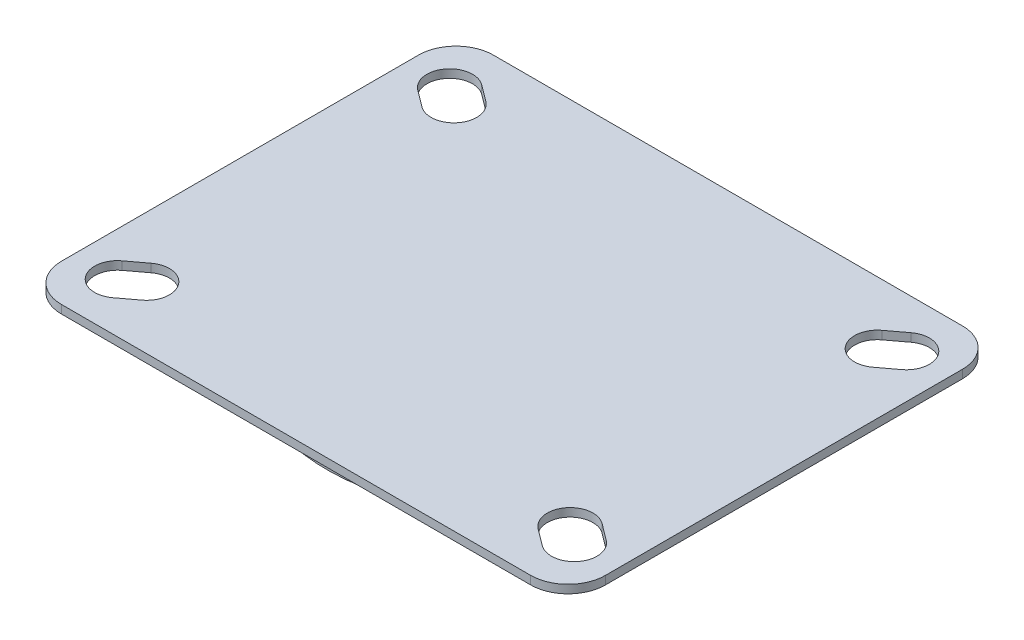
ISO-10303-21;
HEADER;
FILE_DESCRIPTION(('STEP AP214'),'2;1');
FILE_NAME('part.step','',(''),(''),'','','');
FILE_SCHEMA(('AUTOMOTIVE_DESIGN { 1 0 10303 214 1 1 1 1 }'));
ENDSEC;
DATA;
#1=APPLICATION_CONTEXT('core data for automotive mechanical design processes');
#2=APPLICATION_PROTOCOL_DEFINITION('international standard','automotive_design',2000,#1);
#3=PRODUCT_CONTEXT('',#1,'mechanical');
#4=PRODUCT('Part','Part','',(#3));
#5=PRODUCT_RELATED_PRODUCT_CATEGORY('part','',(#4));
#6=PRODUCT_DEFINITION_FORMATION('','',#4);
#7=PRODUCT_DEFINITION_CONTEXT('part definition',#1,'design');
#8=PRODUCT_DEFINITION('design','',#6,#7);
#9=PRODUCT_DEFINITION_SHAPE('','',#8);
#10=(LENGTH_UNIT() NAMED_UNIT(*) SI_UNIT(.MILLI.,.METRE.));
#11=(NAMED_UNIT(*) PLANE_ANGLE_UNIT() SI_UNIT($,.RADIAN.));
#12=(NAMED_UNIT(*) SI_UNIT($,.STERADIAN.) SOLID_ANGLE_UNIT());
#13=UNCERTAINTY_MEASURE_WITH_UNIT(LENGTH_MEASURE(1.E-05),#10,'distance_accuracy_value','');
#14=(GEOMETRIC_REPRESENTATION_CONTEXT(3) GLOBAL_UNCERTAINTY_ASSIGNED_CONTEXT((#13)) GLOBAL_UNIT_ASSIGNED_CONTEXT((#10,
#11,#12)) REPRESENTATION_CONTEXT('',''));
#15=CARTESIAN_POINT('',(0.,0.,0.));
#16=DIRECTION('',(0.,0.,1.));
#17=DIRECTION('',(1.,0.,0.));
#18=AXIS2_PLACEMENT_3D('',#15,#16,#17);
#19=CARTESIAN_POINT('',(0.,-10.,0.));
#20=DIRECTION('',(0.,1.,0.));
#21=DIRECTION('',(0.,0.,1.));
#22=AXIS2_PLACEMENT_3D('',#19,#20,#21);
#23=CYLINDRICAL_SURFACE('',#22,44.5);
#24=CARTESIAN_POINT('',(0.,-10.,0.));
#25=DIRECTION('',(0.,1.,0.));
#26=DIRECTION('',(1.,0.,0.));
#27=AXIS2_PLACEMENT_3D('',#24,#25,#26);
#28=CIRCLE('',#27,44.5);
#29=CARTESIAN_POINT('',(44.5,-10.,0.));
#30=VERTEX_POINT('',#29);
#31=EDGE_CURVE('E12',#30,#30,#28,.T.);
#32=ORIENTED_EDGE('',*,*,#31,.T.);
#33=EDGE_LOOP('',(#32));
#34=FACE_BOUND('',#33,.T.);
#35=CARTESIAN_POINT('',(0.,-2.,0.));
#36=DIRECTION('',(0.,1.,0.));
#37=DIRECTION('',(1.,0.,0.));
#38=AXIS2_PLACEMENT_3D('',#35,#36,#37);
#39=CIRCLE('',#38,44.5);
#40=CARTESIAN_POINT('',(44.5,-2.,0.));
#41=VERTEX_POINT('',#40);
#42=EDGE_CURVE('E57',#41,#41,#39,.T.);
#43=ORIENTED_EDGE('',*,*,#42,.F.);
#44=EDGE_LOOP('',(#43));
#45=FACE_BOUND('',#44,.T.);
#46=ADVANCED_FACE('F54',(#34,#45),#23,.T.);
#47=CARTESIAN_POINT('',(0.,-10.,0.));
#48=DIRECTION('',(0.,1.,0.));
#49=DIRECTION('',(0.,0.,1.));
#50=AXIS2_PLACEMENT_3D('',#47,#48,#49);
#51=PLANE('',#50);
#52=CARTESIAN_POINT('',(0.,-10.,0.));
#53=DIRECTION('',(0.,1.,0.));
#54=DIRECTION('',(0.,0.,1.));
#55=AXIS2_PLACEMENT_3D('',#52,#53,#54);
#56=CIRCLE('',#55,42.5);
#57=CARTESIAN_POINT('',(0.,-10.,42.5));
#58=VERTEX_POINT('',#57);
#59=EDGE_CURVE('E64',#58,#58,#56,.T.);
#60=ORIENTED_EDGE('',*,*,#59,.T.);
#61=EDGE_LOOP('',(#60));
#62=FACE_BOUND('',#61,.T.);
#63=ORIENTED_EDGE('',*,*,#31,.F.);
#64=EDGE_LOOP('',(#63));
#65=FACE_BOUND('',#64,.T.);
#66=ADVANCED_FACE('F72',(#62,#65),#51,.F.);
#67=CARTESIAN_POINT('',(0.,-2.,0.));
#68=DIRECTION('',(0.,1.,0.));
#69=DIRECTION('',(0.,0.,1.));
#70=AXIS2_PLACEMENT_3D('',#67,#68,#69);
#71=PLANE('',#70);
#72=CARTESIAN_POINT('',(0.,-2.,0.));
#73=DIRECTION('',(0.,1.,0.));
#74=DIRECTION('',(0.,0.,1.));
#75=AXIS2_PLACEMENT_3D('',#72,#73,#74);
#76=CIRCLE('',#75,42.5);
#77=CARTESIAN_POINT('',(0.,-2.,42.5));
#78=VERTEX_POINT('',#77);
#79=EDGE_CURVE('E66',#78,#78,#76,.T.);
#80=ORIENTED_EDGE('',*,*,#79,.F.);
#81=EDGE_LOOP('',(#80));
#82=FACE_BOUND('',#81,.T.);
#83=ORIENTED_EDGE('',*,*,#42,.T.);
#84=EDGE_LOOP('',(#83));
#85=FACE_BOUND('',#84,.T.);
#86=ADVANCED_FACE('F78',(#82,#85),#71,.T.);
#87=CARTESIAN_POINT('',(0.,-10.,0.));
#88=DIRECTION('',(0.,1.,0.));
#89=DIRECTION('',(0.,0.,1.));
#90=AXIS2_PLACEMENT_3D('',#87,#88,#89);
#91=CYLINDRICAL_SURFACE('',#90,42.5);
#92=ORIENTED_EDGE('',*,*,#59,.F.);
#93=EDGE_LOOP('',(#92));
#94=FACE_BOUND('',#93,.T.);
#95=ORIENTED_EDGE('',*,*,#79,.T.);
#96=EDGE_LOOP('',(#95));
#97=FACE_BOUND('',#96,.T.);
#98=ADVANCED_FACE('F75',(#94,#97),#91,.F.);
#99=CLOSED_SHELL('',(#46,#66,#86,#98));
#100=MANIFOLD_SOLID_BREP('B2',#99);
#101=CARTESIAN_POINT('',(-56.49561369755,-2.,42.99561369755));
#102=DIRECTION('',(0.,1.,0.));
#103=DIRECTION('',(0.,0.,1.));
#104=AXIS2_PLACEMENT_3D('',#101,#102,#103);
#105=CYLINDRICAL_SURFACE('',#104,9.00438630244995);
#106=CARTESIAN_POINT('',(-56.49561369755,0.,42.99561369755));
#107=DIRECTION('',(0.,1.,0.));
#108=DIRECTION('',(0.,0.,-1.));
#109=AXIS2_PLACEMENT_3D('',#106,#107,#108);
#110=CIRCLE('',#109,9.00438630244995);
#111=CARTESIAN_POINT('',(-65.5,0.,42.99561369755));
#112=VERTEX_POINT('',#111);
#113=CARTESIAN_POINT('',(-56.49561369755,0.,52.));
#114=VERTEX_POINT('',#113);
#115=EDGE_CURVE('E403',#112,#114,#110,.T.);
#116=ORIENTED_EDGE('',*,*,#115,.F.);
#117=DIRECTION('',(0.,1.,0.));
#118=VECTOR('',#117,1.);
#119=CARTESIAN_POINT('',(-65.5,-2.,42.99561369755));
#120=LINE('',#119,#118);
#121=CARTESIAN_POINT('',(-65.5,-2.,42.99561369755));
#122=VERTEX_POINT('',#121);
#123=EDGE_CURVE('E52',#122,#112,#120,.T.);
#124=ORIENTED_EDGE('',*,*,#123,.F.);
#125=CARTESIAN_POINT('',(-56.49561369755,-2.,42.99561369755));
#126=DIRECTION('',(0.,1.,0.));
#127=DIRECTION('',(0.,0.,-1.));
#128=AXIS2_PLACEMENT_3D('',#125,#126,#127);
#129=CIRCLE('',#128,9.00438630244995);
#130=CARTESIAN_POINT('',(-56.49561369755,-2.,52.));
#131=VERTEX_POINT('',#130);
#132=EDGE_CURVE('E410',#122,#131,#129,.T.);
#133=ORIENTED_EDGE('',*,*,#132,.T.);
#134=DIRECTION('',(0.,1.,0.));
#135=VECTOR('',#134,1.);
#136=CARTESIAN_POINT('',(-56.49561369755,-2.,52.));
#137=LINE('',#136,#135);
#138=EDGE_CURVE('E119',#131,#114,#137,.T.);
#139=ORIENTED_EDGE('',*,*,#138,.T.);
#140=EDGE_LOOP('',(#116,#124,#133,#139));
#141=FACE_BOUND('',#140,.T.);
#142=ADVANCED_FACE('F116',(#141),#105,.T.);
#143=CARTESIAN_POINT('',(-65.5,-2.,42.99561369755));
#144=DIRECTION('',(-1.,0.,0.));
#145=DIRECTION('',(0.,0.,1.));
#146=AXIS2_PLACEMENT_3D('',#143,#144,#145);
#147=PLANE('',#146);
#148=DIRECTION('',(0.,0.,1.));
#149=VECTOR('',#148,1.);
#150=CARTESIAN_POINT('',(-65.5,0.,42.99561369755));
#151=LINE('',#150,#149);
#152=CARTESIAN_POINT('',(-65.5,0.,-42.99561369755));
#153=VERTEX_POINT('',#152);
#154=EDGE_CURVE('E414',#153,#112,#151,.T.);
#155=ORIENTED_EDGE('',*,*,#154,.F.);
#156=DIRECTION('',(0.,1.,0.));
#157=VECTOR('',#156,1.);
#158=CARTESIAN_POINT('',(-65.5,-2.,-42.99561369755));
#159=LINE('',#158,#157);
#160=CARTESIAN_POINT('',(-65.5,-2.,-42.99561369755));
#161=VERTEX_POINT('',#160);
#162=EDGE_CURVE('E124',#161,#153,#159,.T.);
#163=ORIENTED_EDGE('',*,*,#162,.F.);
#164=DIRECTION('',(0.,0.,1.));
#165=VECTOR('',#164,1.);
#166=CARTESIAN_POINT('',(-65.5,-2.,42.99561369755));
#167=LINE('',#166,#165);
#168=EDGE_CURVE('E432',#161,#122,#167,.T.);
#169=ORIENTED_EDGE('',*,*,#168,.T.);
#170=ORIENTED_EDGE('',*,*,#123,.T.);
#171=EDGE_LOOP('',(#155,#163,#169,#170));
#172=FACE_BOUND('',#171,.T.);
#173=ADVANCED_FACE('F479',(#172),#147,.T.);
#174=CARTESIAN_POINT('',(-56.49561369755,-2.,-42.99561369755));
#175=DIRECTION('',(0.,1.,0.));
#176=DIRECTION('',(0.,0.,1.));
#177=AXIS2_PLACEMENT_3D('',#174,#175,#176);
#178=CYLINDRICAL_SURFACE('',#177,9.00438630244996);
#179=CARTESIAN_POINT('',(-56.49561369755,0.,-42.99561369755));
#180=DIRECTION('',(0.,1.,0.));
#181=DIRECTION('',(0.,0.,-1.));
#182=AXIS2_PLACEMENT_3D('',#179,#180,#181);
#183=CIRCLE('',#182,9.00438630244996);
#184=CARTESIAN_POINT('',(-56.49561369755,0.,-52.));
#185=VERTEX_POINT('',#184);
#186=EDGE_CURVE('E452',#185,#153,#183,.T.);
#187=ORIENTED_EDGE('',*,*,#186,.F.);
#188=DIRECTION('',(0.,1.,0.));
#189=VECTOR('',#188,1.);
#190=CARTESIAN_POINT('',(-56.49561369755,-2.,-52.));
#191=LINE('',#190,#189);
#192=CARTESIAN_POINT('',(-56.49561369755,-2.,-52.));
#193=VERTEX_POINT('',#192);
#194=EDGE_CURVE('E458',#193,#185,#191,.T.);
#195=ORIENTED_EDGE('',*,*,#194,.F.);
#196=CARTESIAN_POINT('',(-56.49561369755,-2.,-42.99561369755));
#197=DIRECTION('',(0.,1.,0.));
#198=DIRECTION('',(0.,0.,-1.));
#199=AXIS2_PLACEMENT_3D('',#196,#197,#198);
#200=CIRCLE('',#199,9.00438630244996);
#201=EDGE_CURVE('E429',#193,#161,#200,.T.);
#202=ORIENTED_EDGE('',*,*,#201,.T.);
#203=ORIENTED_EDGE('',*,*,#162,.T.);
#204=EDGE_LOOP('',(#187,#195,#202,#203));
#205=FACE_BOUND('',#204,.T.);
#206=ADVANCED_FACE('F499',(#205),#178,.T.);
#207=CARTESIAN_POINT('',(-56.49561369755,-2.,-52.));
#208=DIRECTION('',(0.,0.,-1.));
#209=DIRECTION('',(-1.,0.,0.));
#210=AXIS2_PLACEMENT_3D('',#207,#208,#209);
#211=PLANE('',#210);
#212=DIRECTION('',(-1.,0.,0.));
#213=VECTOR('',#212,1.);
#214=CARTESIAN_POINT('',(-56.49561369755,0.,-52.));
#215=LINE('',#214,#213);
#216=CARTESIAN_POINT('',(56.49561369755,0.,-52.));
#217=VERTEX_POINT('',#216);
#218=EDGE_CURVE('E449',#217,#185,#215,.T.);
#219=ORIENTED_EDGE('',*,*,#218,.F.);
#220=DIRECTION('',(0.,1.,0.));
#221=VECTOR('',#220,1.);
#222=CARTESIAN_POINT('',(56.49561369755,-2.,-52.));
#223=LINE('',#222,#221);
#224=CARTESIAN_POINT('',(56.49561369755,-2.,-52.));
#225=VERTEX_POINT('',#224);
#226=EDGE_CURVE('E460',#225,#217,#223,.T.);
#227=ORIENTED_EDGE('',*,*,#226,.F.);
#228=DIRECTION('',(-1.,0.,0.));
#229=VECTOR('',#228,1.);
#230=CARTESIAN_POINT('',(-56.49561369755,-2.,-52.));
#231=LINE('',#230,#229);
#232=EDGE_CURVE('E426',#225,#193,#231,.T.);
#233=ORIENTED_EDGE('',*,*,#232,.T.);
#234=ORIENTED_EDGE('',*,*,#194,.T.);
#235=EDGE_LOOP('',(#219,#227,#233,#234));
#236=FACE_BOUND('',#235,.T.);
#237=ADVANCED_FACE('F497',(#236),#211,.T.);
#238=CARTESIAN_POINT('',(56.49561369755,-2.,-42.99561369755));
#239=DIRECTION('',(0.,1.,0.));
#240=DIRECTION('',(0.,0.,1.));
#241=AXIS2_PLACEMENT_3D('',#238,#239,#240);
#242=CYLINDRICAL_SURFACE('',#241,9.00438630244995);
#243=CARTESIAN_POINT('',(56.49561369755,0.,-42.99561369755));
#244=DIRECTION('',(0.,1.,0.));
#245=DIRECTION('',(0.,0.,-1.));
#246=AXIS2_PLACEMENT_3D('',#243,#244,#245);
#247=CIRCLE('',#246,9.00438630244995);
#248=CARTESIAN_POINT('',(65.5,0.,-42.99561369755));
#249=VERTEX_POINT('',#248);
#250=EDGE_CURVE('E446',#249,#217,#247,.T.);
#251=ORIENTED_EDGE('',*,*,#250,.F.);
#252=DIRECTION('',(0.,1.,0.));
#253=VECTOR('',#252,1.);
#254=CARTESIAN_POINT('',(65.5,-2.,-42.99561369755));
#255=LINE('',#254,#253);
#256=CARTESIAN_POINT('',(65.5,-2.,-42.99561369755));
#257=VERTEX_POINT('',#256);
#258=EDGE_CURVE('E462',#257,#249,#255,.T.);
#259=ORIENTED_EDGE('',*,*,#258,.F.);
#260=CARTESIAN_POINT('',(56.49561369755,-2.,-42.99561369755));
#261=DIRECTION('',(0.,1.,0.));
#262=DIRECTION('',(0.,0.,-1.));
#263=AXIS2_PLACEMENT_3D('',#260,#261,#262);
#264=CIRCLE('',#263,9.00438630244995);
#265=EDGE_CURVE('E423',#257,#225,#264,.T.);
#266=ORIENTED_EDGE('',*,*,#265,.T.);
#267=ORIENTED_EDGE('',*,*,#226,.T.);
#268=EDGE_LOOP('',(#251,#259,#266,#267));
#269=FACE_BOUND('',#268,.T.);
#270=ADVANCED_FACE('F493',(#269),#242,.T.);
#271=CARTESIAN_POINT('',(65.5,-2.,42.99561369755));
#272=DIRECTION('',(1.,0.,0.));
#273=DIRECTION('',(0.,0.,-1.));
#274=AXIS2_PLACEMENT_3D('',#271,#272,#273);
#275=PLANE('',#274);
#276=DIRECTION('',(0.,0.,-1.));
#277=VECTOR('',#276,1.);
#278=CARTESIAN_POINT('',(65.5,0.,42.99561369755));
#279=LINE('',#278,#277);
#280=CARTESIAN_POINT('',(65.5,0.,42.99561369755));
#281=VERTEX_POINT('',#280);
#282=EDGE_CURVE('E443',#281,#249,#279,.T.);
#283=ORIENTED_EDGE('',*,*,#282,.F.);
#284=DIRECTION('',(0.,1.,0.));
#285=VECTOR('',#284,1.);
#286=CARTESIAN_POINT('',(65.5,-2.,42.99561369755));
#287=LINE('',#286,#285);
#288=CARTESIAN_POINT('',(65.5,-2.,42.99561369755));
#289=VERTEX_POINT('',#288);
#290=EDGE_CURVE('E464',#289,#281,#287,.T.);
#291=ORIENTED_EDGE('',*,*,#290,.F.);
#292=DIRECTION('',(0.,0.,-1.));
#293=VECTOR('',#292,1.);
#294=CARTESIAN_POINT('',(65.5,-2.,42.99561369755));
#295=LINE('',#294,#293);
#296=EDGE_CURVE('E420',#289,#257,#295,.T.);
#297=ORIENTED_EDGE('',*,*,#296,.T.);
#298=ORIENTED_EDGE('',*,*,#258,.T.);
#299=EDGE_LOOP('',(#283,#291,#297,#298));
#300=FACE_BOUND('',#299,.T.);
#301=ADVANCED_FACE('F491',(#300),#275,.T.);
#302=CARTESIAN_POINT('',(56.49561369755,-2.,42.99561369755));
#303=DIRECTION('',(0.,1.,0.));
#304=DIRECTION('',(0.,0.,1.));
#305=AXIS2_PLACEMENT_3D('',#302,#303,#304);
#306=CYLINDRICAL_SURFACE('',#305,9.00438630244996);
#307=CARTESIAN_POINT('',(56.49561369755,0.,42.99561369755));
#308=DIRECTION('',(0.,1.,0.));
#309=DIRECTION('',(0.,0.,1.));
#310=AXIS2_PLACEMENT_3D('',#307,#308,#309);
#311=CIRCLE('',#310,9.00438630244996);
#312=CARTESIAN_POINT('',(56.49561369755,0.,52.));
#313=VERTEX_POINT('',#312);
#314=EDGE_CURVE('E440',#313,#281,#311,.T.);
#315=ORIENTED_EDGE('',*,*,#314,.F.);
#316=DIRECTION('',(0.,1.,0.));
#317=VECTOR('',#316,1.);
#318=CARTESIAN_POINT('',(56.49561369755,-2.,52.));
#319=LINE('',#318,#317);
#320=CARTESIAN_POINT('',(56.49561369755,-2.,52.));
#321=VERTEX_POINT('',#320);
#322=EDGE_CURVE('E465',#321,#313,#319,.T.);
#323=ORIENTED_EDGE('',*,*,#322,.F.);
#324=CARTESIAN_POINT('',(56.49561369755,-2.,42.99561369755));
#325=DIRECTION('',(0.,1.,0.));
#326=DIRECTION('',(0.,0.,1.));
#327=AXIS2_PLACEMENT_3D('',#324,#325,#326);
#328=CIRCLE('',#327,9.00438630244996);
#329=EDGE_CURVE('E417',#321,#289,#328,.T.);
#330=ORIENTED_EDGE('',*,*,#329,.T.);
#331=ORIENTED_EDGE('',*,*,#290,.T.);
#332=EDGE_LOOP('',(#315,#323,#330,#331));
#333=FACE_BOUND('',#332,.T.);
#334=ADVANCED_FACE('F487',(#333),#306,.T.);
#335=CARTESIAN_POINT('',(-56.49561369755,-2.,52.));
#336=DIRECTION('',(0.,0.,1.));
#337=DIRECTION('',(1.,0.,0.));
#338=AXIS2_PLACEMENT_3D('',#335,#336,#337);
#339=PLANE('',#338);
#340=DIRECTION('',(1.,0.,0.));
#341=VECTOR('',#340,1.);
#342=CARTESIAN_POINT('',(-56.49561369755,0.,52.));
#343=LINE('',#342,#341);
#344=EDGE_CURVE('E437',#114,#313,#343,.T.);
#345=ORIENTED_EDGE('',*,*,#344,.F.);
#346=ORIENTED_EDGE('',*,*,#138,.F.);
#347=DIRECTION('',(1.,0.,0.));
#348=VECTOR('',#347,1.);
#349=CARTESIAN_POINT('',(-56.49561369755,-2.,52.));
#350=LINE('',#349,#348);
#351=EDGE_CURVE('E413',#131,#321,#350,.T.);
#352=ORIENTED_EDGE('',*,*,#351,.T.);
#353=ORIENTED_EDGE('',*,*,#322,.T.);
#354=EDGE_LOOP('',(#345,#346,#352,#353));
#355=FACE_BOUND('',#354,.T.);
#356=ADVANCED_FACE('F473',(#355),#339,.T.);
#357=CARTESIAN_POINT('',(-56.49561369755,-2.,42.99561369755));
#358=DIRECTION('',(0.,-1.,0.));
#359=DIRECTION('',(0.,0.,-1.));
#360=AXIS2_PLACEMENT_3D('',#357,#358,#359);
#361=PLANE('',#360);
#362=CARTESIAN_POINT('',(54.9901951359279,-2.,40.));
#363=DIRECTION('',(0.,1.,0.));
#364=DIRECTION('',(0.,0.,1.));
#365=AXIS2_PLACEMENT_3D('',#362,#363,#364);
#366=CIRCLE('',#365,5.5);
#367=CARTESIAN_POINT('',(51.6901951359279,-2.,44.4));
#368=VERTEX_POINT('',#367);
#369=CARTESIAN_POINT('',(58.2901951359279,-2.,35.6));
#370=VERTEX_POINT('',#369);
#371=EDGE_CURVE('E279',#368,#370,#366,.T.);
#372=ORIENTED_EDGE('',*,*,#371,.T.);
#373=DIRECTION('',(-0.799999999999999,0.,-0.600000000000001));
#374=VECTOR('',#373,1.);
#375=CARTESIAN_POINT('',(58.2901951359279,-2.,35.6));
#376=LINE('',#375,#374);
#377=CARTESIAN_POINT('',(54.2901951359278,-2.,32.5999999999999));
#378=VERTEX_POINT('',#377);
#379=EDGE_CURVE('E288',#370,#378,#376,.T.);
#380=ORIENTED_EDGE('',*,*,#379,.T.);
#381=CARTESIAN_POINT('',(50.9901951359279,-2.,37.));
#382=DIRECTION('',(0.,1.,0.));
#383=DIRECTION('',(0.,0.,1.));
#384=AXIS2_PLACEMENT_3D('',#381,#382,#383);
#385=CIRCLE('',#384,5.49999999999999);
#386=CARTESIAN_POINT('',(47.6901951359278,-2.,41.3999999999999));
#387=VERTEX_POINT('',#386);
#388=EDGE_CURVE('E132',#378,#387,#385,.T.);
#389=ORIENTED_EDGE('',*,*,#388,.T.);
#390=DIRECTION('',(0.799999999999998,0.,0.600000000000003));
#391=VECTOR('',#390,1.);
#392=CARTESIAN_POINT('',(51.6901951359279,-2.,44.4));
#393=LINE('',#392,#391);
#394=EDGE_CURVE('E285',#387,#368,#393,.T.);
#395=ORIENTED_EDGE('',*,*,#394,.T.);
#396=EDGE_LOOP('',(#372,#380,#389,#395));
#397=FACE_BOUND('',#396,.T.);
#398=CARTESIAN_POINT('',(-54.9901951359278,-2.,40.));
#399=DIRECTION('',(0.,1.,0.));
#400=DIRECTION('',(0.,0.,-1.));
#401=AXIS2_PLACEMENT_3D('',#398,#399,#400);
#402=CIRCLE('',#401,5.5);
#403=CARTESIAN_POINT('',(-58.2901951359279,-2.,35.6));
#404=VERTEX_POINT('',#403);
#405=CARTESIAN_POINT('',(-51.6901951359278,-2.,44.4));
#406=VERTEX_POINT('',#405);
#407=EDGE_CURVE('E314',#404,#406,#402,.T.);
#408=ORIENTED_EDGE('',*,*,#407,.T.);
#409=DIRECTION('',(0.799999999999998,0.,-0.600000000000003));
#410=VECTOR('',#409,1.);
#411=CARTESIAN_POINT('',(-51.6901951359278,-2.,44.4));
#412=LINE('',#411,#410);
#413=CARTESIAN_POINT('',(-47.6901951359278,-2.,41.3999999999999));
#414=VERTEX_POINT('',#413);
#415=EDGE_CURVE('E317',#406,#414,#412,.T.);
#416=ORIENTED_EDGE('',*,*,#415,.T.);
#417=CARTESIAN_POINT('',(-50.9901951359278,-2.,37.));
#418=DIRECTION('',(0.,1.,0.));
#419=DIRECTION('',(0.,0.,-1.));
#420=AXIS2_PLACEMENT_3D('',#417,#418,#419);
#421=CIRCLE('',#420,5.49999999999999);
#422=CARTESIAN_POINT('',(-54.2901951359278,-2.,32.6));
#423=VERTEX_POINT('',#422);
#424=EDGE_CURVE('E321',#414,#423,#421,.T.);
#425=ORIENTED_EDGE('',*,*,#424,.T.);
#426=DIRECTION('',(-0.799999999999999,0.,0.600000000000001));
#427=VECTOR('',#426,1.);
#428=CARTESIAN_POINT('',(-58.2901951359279,-2.,35.6));
#429=LINE('',#428,#427);
#430=EDGE_CURVE('E324',#423,#404,#429,.T.);
#431=ORIENTED_EDGE('',*,*,#430,.T.);
#432=EDGE_LOOP('',(#408,#416,#425,#431));
#433=FACE_BOUND('',#432,.T.);
#434=CARTESIAN_POINT('',(54.9901951359279,-2.,-40.));
#435=DIRECTION('',(0.,1.,0.));
#436=DIRECTION('',(0.,0.,-1.));
#437=AXIS2_PLACEMENT_3D('',#434,#435,#436);
#438=CIRCLE('',#437,5.5);
#439=CARTESIAN_POINT('',(58.2901951359279,-2.,-35.6));
#440=VERTEX_POINT('',#439);
#441=CARTESIAN_POINT('',(51.6901951359279,-2.,-44.4));
#442=VERTEX_POINT('',#441);
#443=EDGE_CURVE('E346',#440,#442,#438,.T.);
#444=ORIENTED_EDGE('',*,*,#443,.T.);
#445=DIRECTION('',(-0.799999999999998,0.,0.600000000000003));
#446=VECTOR('',#445,1.);
#447=CARTESIAN_POINT('',(51.6901951359279,-2.,-44.4));
#448=LINE('',#447,#446);
#449=CARTESIAN_POINT('',(47.6901951359278,-2.,-41.3999999999999));
#450=VERTEX_POINT('',#449);
#451=EDGE_CURVE('E349',#442,#450,#448,.T.);
#452=ORIENTED_EDGE('',*,*,#451,.T.);
#453=CARTESIAN_POINT('',(50.9901951359279,-2.,-37.));
#454=DIRECTION('',(0.,1.,0.));
#455=DIRECTION('',(0.,0.,-1.));
#456=AXIS2_PLACEMENT_3D('',#453,#454,#455);
#457=CIRCLE('',#456,5.49999999999999);
#458=CARTESIAN_POINT('',(54.2901951359278,-2.,-32.6));
#459=VERTEX_POINT('',#458);
#460=EDGE_CURVE('E353',#450,#459,#457,.T.);
#461=ORIENTED_EDGE('',*,*,#460,.T.);
#462=DIRECTION('',(0.799999999999999,0.,-0.600000000000001));
#463=VECTOR('',#462,1.);
#464=CARTESIAN_POINT('',(58.2901951359279,-2.,-35.6));
#465=LINE('',#464,#463);
#466=EDGE_CURVE('E356',#459,#440,#465,.T.);
#467=ORIENTED_EDGE('',*,*,#466,.T.);
#468=EDGE_LOOP('',(#444,#452,#461,#467));
#469=FACE_BOUND('',#468,.T.);
#470=CARTESIAN_POINT('',(-54.9901951359278,-2.,-40.));
#471=DIRECTION('',(0.,1.,0.));
#472=DIRECTION('',(0.,0.,1.));
#473=AXIS2_PLACEMENT_3D('',#470,#471,#472);
#474=CIRCLE('',#473,5.49999999999999);
#475=CARTESIAN_POINT('',(-51.6901951359279,-2.,-44.4));
#476=VERTEX_POINT('',#475);
#477=CARTESIAN_POINT('',(-58.2901951359279,-2.,-35.6));
#478=VERTEX_POINT('',#477);
#479=EDGE_CURVE('E378',#476,#478,#474,.T.);
#480=ORIENTED_EDGE('',*,*,#479,.T.);
#481=DIRECTION('',(0.799999999999999,0.,0.600000000000001));
#482=VECTOR('',#481,1.);
#483=CARTESIAN_POINT('',(-58.2901951359279,-2.,-35.6));
#484=LINE('',#483,#482);
#485=CARTESIAN_POINT('',(-54.2901951359278,-2.,-32.5999999999999));
#486=VERTEX_POINT('',#485);
#487=EDGE_CURVE('E381',#478,#486,#484,.T.);
#488=ORIENTED_EDGE('',*,*,#487,.T.);
#489=CARTESIAN_POINT('',(-50.9901951359278,-2.,-37.));
#490=DIRECTION('',(0.,1.,0.));
#491=DIRECTION('',(0.,0.,1.));
#492=AXIS2_PLACEMENT_3D('',#489,#490,#491);
#493=CIRCLE('',#492,5.49999999999999);
#494=CARTESIAN_POINT('',(-47.6901951359278,-2.,-41.3999999999999));
#495=VERTEX_POINT('',#494);
#496=EDGE_CURVE('E385',#486,#495,#493,.T.);
#497=ORIENTED_EDGE('',*,*,#496,.T.);
#498=DIRECTION('',(-0.799999999999999,0.,-0.600000000000002));
#499=VECTOR('',#498,1.);
#500=CARTESIAN_POINT('',(-51.6901951359279,-2.,-44.4));
#501=LINE('',#500,#499);
#502=EDGE_CURVE('E388',#495,#476,#501,.T.);
#503=ORIENTED_EDGE('',*,*,#502,.T.);
#504=EDGE_LOOP('',(#480,#488,#497,#503));
#505=FACE_BOUND('',#504,.T.);
#506=ORIENTED_EDGE('',*,*,#132,.F.);
#507=ORIENTED_EDGE('',*,*,#168,.F.);
#508=ORIENTED_EDGE('',*,*,#201,.F.);
#509=ORIENTED_EDGE('',*,*,#232,.F.);
#510=ORIENTED_EDGE('',*,*,#265,.F.);
#511=ORIENTED_EDGE('',*,*,#296,.F.);
#512=ORIENTED_EDGE('',*,*,#329,.F.);
#513=ORIENTED_EDGE('',*,*,#351,.F.);
#514=EDGE_LOOP('',(#506,#507,#508,#509,#510,#511,#512,#513));
#515=FACE_BOUND('',#514,.T.);
#516=ADVANCED_FACE('F292',(#397,#433,#469,#505,#515),#361,.T.);
#517=CARTESIAN_POINT('',(-56.49561369755,0.,42.99561369755));
#518=DIRECTION('',(0.,-1.,0.));
#519=DIRECTION('',(0.,0.,-1.));
#520=AXIS2_PLACEMENT_3D('',#517,#518,#519);
#521=PLANE('',#520);
#522=DIRECTION('',(-0.799999999999999,0.,-0.600000000000001));
#523=VECTOR('',#522,1.);
#524=CARTESIAN_POINT('',(58.2901951359279,0.,35.6));
#525=LINE('',#524,#523);
#526=CARTESIAN_POINT('',(58.2901951359279,0.,35.6));
#527=VERTEX_POINT('',#526);
#528=CARTESIAN_POINT('',(54.2901951359278,0.,32.6));
#529=VERTEX_POINT('',#528);
#530=EDGE_CURVE('E304',#527,#529,#525,.T.);
#531=ORIENTED_EDGE('',*,*,#530,.F.);
#532=CARTESIAN_POINT('',(54.9901951359279,0.,40.));
#533=DIRECTION('',(0.,1.,0.));
#534=DIRECTION('',(0.,0.,1.));
#535=AXIS2_PLACEMENT_3D('',#532,#533,#534);
#536=CIRCLE('',#535,5.5);
#537=CARTESIAN_POINT('',(51.6901951359279,0.,44.4));
#538=VERTEX_POINT('',#537);
#539=EDGE_CURVE('E140',#538,#527,#536,.T.);
#540=ORIENTED_EDGE('',*,*,#539,.F.);
#541=DIRECTION('',(0.799999999999998,0.,0.600000000000003));
#542=VECTOR('',#541,1.);
#543=CARTESIAN_POINT('',(51.6901951359279,0.,44.4));
#544=LINE('',#543,#542);
#545=CARTESIAN_POINT('',(47.6901951359278,0.,41.3999999999999));
#546=VERTEX_POINT('',#545);
#547=EDGE_CURVE('E295',#546,#538,#544,.T.);
#548=ORIENTED_EDGE('',*,*,#547,.F.);
#549=CARTESIAN_POINT('',(50.9901951359279,0.,37.));
#550=DIRECTION('',(0.,1.,0.));
#551=DIRECTION('',(0.,0.,1.));
#552=AXIS2_PLACEMENT_3D('',#549,#550,#551);
#553=CIRCLE('',#552,5.49999999999999);
#554=EDGE_CURVE('E298',#529,#546,#553,.T.);
#555=ORIENTED_EDGE('',*,*,#554,.F.);
#556=EDGE_LOOP('',(#531,#540,#548,#555));
#557=FACE_BOUND('',#556,.T.);
#558=DIRECTION('',(0.799999999999998,0.,-0.600000000000003));
#559=VECTOR('',#558,1.);
#560=CARTESIAN_POINT('',(-51.6901951359278,0.,44.4));
#561=LINE('',#560,#559);
#562=CARTESIAN_POINT('',(-51.6901951359278,0.,44.4));
#563=VERTEX_POINT('',#562);
#564=CARTESIAN_POINT('',(-47.6901951359278,0.,41.3999999999999));
#565=VERTEX_POINT('',#564);
#566=EDGE_CURVE('E329',#563,#565,#561,.T.);
#567=ORIENTED_EDGE('',*,*,#566,.F.);
#568=CARTESIAN_POINT('',(-54.9901951359278,0.,40.));
#569=DIRECTION('',(0.,1.,0.));
#570=DIRECTION('',(0.,0.,-1.));
#571=AXIS2_PLACEMENT_3D('',#568,#569,#570);
#572=CIRCLE('',#571,5.5);
#573=CARTESIAN_POINT('',(-58.2901951359279,0.,35.6));
#574=VERTEX_POINT('',#573);
#575=EDGE_CURVE('E310',#574,#563,#572,.T.);
#576=ORIENTED_EDGE('',*,*,#575,.F.);
#577=DIRECTION('',(-0.799999999999999,0.,0.600000000000001));
#578=VECTOR('',#577,1.);
#579=CARTESIAN_POINT('',(-58.2901951359279,0.,35.6));
#580=LINE('',#579,#578);
#581=CARTESIAN_POINT('',(-54.2901951359278,0.,32.6));
#582=VERTEX_POINT('',#581);
#583=EDGE_CURVE('E318',#582,#574,#580,.T.);
#584=ORIENTED_EDGE('',*,*,#583,.F.);
#585=CARTESIAN_POINT('',(-50.9901951359278,0.,37.));
#586=DIRECTION('',(0.,1.,0.));
#587=DIRECTION('',(0.,0.,-1.));
#588=AXIS2_PLACEMENT_3D('',#585,#586,#587);
#589=CIRCLE('',#588,5.49999999999999);
#590=EDGE_CURVE('E332',#565,#582,#589,.T.);
#591=ORIENTED_EDGE('',*,*,#590,.F.);
#592=EDGE_LOOP('',(#567,#576,#584,#591));
#593=FACE_BOUND('',#592,.T.);
#594=DIRECTION('',(-0.799999999999998,0.,0.600000000000003));
#595=VECTOR('',#594,1.);
#596=CARTESIAN_POINT('',(51.6901951359279,0.,-44.4));
#597=LINE('',#596,#595);
#598=CARTESIAN_POINT('',(51.6901951359279,0.,-44.4));
#599=VERTEX_POINT('',#598);
#600=CARTESIAN_POINT('',(47.6901951359278,0.,-41.3999999999999));
#601=VERTEX_POINT('',#600);
#602=EDGE_CURVE('E361',#599,#601,#597,.T.);
#603=ORIENTED_EDGE('',*,*,#602,.F.);
#604=CARTESIAN_POINT('',(54.9901951359279,0.,-40.));
#605=DIRECTION('',(0.,1.,0.));
#606=DIRECTION('',(0.,0.,-1.));
#607=AXIS2_PLACEMENT_3D('',#604,#605,#606);
#608=CIRCLE('',#607,5.5);
#609=CARTESIAN_POINT('',(58.2901951359279,0.,-35.6));
#610=VERTEX_POINT('',#609);
#611=EDGE_CURVE('E339',#610,#599,#608,.T.);
#612=ORIENTED_EDGE('',*,*,#611,.F.);
#613=DIRECTION('',(0.799999999999999,0.,-0.600000000000001));
#614=VECTOR('',#613,1.);
#615=CARTESIAN_POINT('',(58.2901951359279,0.,-35.6));
#616=LINE('',#615,#614);
#617=CARTESIAN_POINT('',(54.2901951359278,0.,-32.6));
#618=VERTEX_POINT('',#617);
#619=EDGE_CURVE('E350',#618,#610,#616,.T.);
#620=ORIENTED_EDGE('',*,*,#619,.F.);
#621=CARTESIAN_POINT('',(50.9901951359279,0.,-37.));
#622=DIRECTION('',(0.,1.,0.));
#623=DIRECTION('',(0.,0.,-1.));
#624=AXIS2_PLACEMENT_3D('',#621,#622,#623);
#625=CIRCLE('',#624,5.49999999999999);
#626=EDGE_CURVE('E364',#601,#618,#625,.T.);
#627=ORIENTED_EDGE('',*,*,#626,.F.);
#628=EDGE_LOOP('',(#603,#612,#620,#627));
#629=FACE_BOUND('',#628,.T.);
#630=DIRECTION('',(0.799999999999999,0.,0.600000000000001));
#631=VECTOR('',#630,1.);
#632=CARTESIAN_POINT('',(-58.2901951359279,0.,-35.6));
#633=LINE('',#632,#631);
#634=CARTESIAN_POINT('',(-58.2901951359279,0.,-35.6));
#635=VERTEX_POINT('',#634);
#636=CARTESIAN_POINT('',(-54.2901951359278,0.,-32.6));
#637=VERTEX_POINT('',#636);
#638=EDGE_CURVE('E393',#635,#637,#633,.T.);
#639=ORIENTED_EDGE('',*,*,#638,.F.);
#640=CARTESIAN_POINT('',(-54.9901951359278,0.,-40.));
#641=DIRECTION('',(0.,1.,0.));
#642=DIRECTION('',(0.,0.,1.));
#643=AXIS2_PLACEMENT_3D('',#640,#641,#642);
#644=CIRCLE('',#643,5.49999999999999);
#645=CARTESIAN_POINT('',(-51.6901951359279,0.,-44.4));
#646=VERTEX_POINT('',#645);
#647=EDGE_CURVE('E371',#646,#635,#644,.T.);
#648=ORIENTED_EDGE('',*,*,#647,.F.);
#649=DIRECTION('',(-0.799999999999999,0.,-0.600000000000002));
#650=VECTOR('',#649,1.);
#651=CARTESIAN_POINT('',(-51.6901951359279,0.,-44.4));
#652=LINE('',#651,#650);
#653=CARTESIAN_POINT('',(-47.6901951359278,0.,-41.3999999999999));
#654=VERTEX_POINT('',#653);
#655=EDGE_CURVE('E382',#654,#646,#652,.T.);
#656=ORIENTED_EDGE('',*,*,#655,.F.);
#657=CARTESIAN_POINT('',(-50.9901951359278,0.,-37.));
#658=DIRECTION('',(0.,1.,0.));
#659=DIRECTION('',(0.,0.,1.));
#660=AXIS2_PLACEMENT_3D('',#657,#658,#659);
#661=CIRCLE('',#660,5.49999999999999);
#662=EDGE_CURVE('E396',#637,#654,#661,.T.);
#663=ORIENTED_EDGE('',*,*,#662,.F.);
#664=EDGE_LOOP('',(#639,#648,#656,#663));
#665=FACE_BOUND('',#664,.T.);
#666=ORIENTED_EDGE('',*,*,#115,.T.);
#667=ORIENTED_EDGE('',*,*,#344,.T.);
#668=ORIENTED_EDGE('',*,*,#314,.T.);
#669=ORIENTED_EDGE('',*,*,#282,.T.);
#670=ORIENTED_EDGE('',*,*,#250,.T.);
#671=ORIENTED_EDGE('',*,*,#218,.T.);
#672=ORIENTED_EDGE('',*,*,#186,.T.);
#673=ORIENTED_EDGE('',*,*,#154,.T.);
#674=EDGE_LOOP('',(#666,#667,#668,#669,#670,#671,#672,#673));
#675=FACE_BOUND('',#674,.T.);
#676=ADVANCED_FACE('F475',(#557,#593,#629,#665,#675),#521,.F.);
#677=CARTESIAN_POINT('',(-54.9901951359278,-2.,-40.));
#678=DIRECTION('',(0.,1.,0.));
#679=DIRECTION('',(0.,0.,1.));
#680=AXIS2_PLACEMENT_3D('',#677,#678,#679);
#681=CYLINDRICAL_SURFACE('',#680,5.49999999999999);
#682=ORIENTED_EDGE('',*,*,#647,.T.);
#683=DIRECTION('',(0.,1.,0.));
#684=VECTOR('',#683,1.);
#685=CARTESIAN_POINT('',(-58.2901951359279,-2.,-35.6));
#686=LINE('',#685,#684);
#687=EDGE_CURVE('E391',#478,#635,#686,.T.);
#688=ORIENTED_EDGE('',*,*,#687,.F.);
#689=ORIENTED_EDGE('',*,*,#479,.F.);
#690=DIRECTION('',(0.,1.,0.));
#691=VECTOR('',#690,1.);
#692=CARTESIAN_POINT('',(-51.6901951359279,-2.,-44.4));
#693=LINE('',#692,#691);
#694=EDGE_CURVE('E401',#476,#646,#693,.T.);
#695=ORIENTED_EDGE('',*,*,#694,.T.);
#696=EDGE_LOOP('',(#682,#688,#689,#695));
#697=FACE_BOUND('',#696,.T.);
#698=ADVANCED_FACE('F581',(#697),#681,.F.);
#699=CARTESIAN_POINT('',(-51.6901951359279,-2.,-44.4));
#700=DIRECTION('',(0.600000000000002,0.,-0.799999999999999));
#701=DIRECTION('',(-0.799999999999999,0.,-0.600000000000002));
#702=AXIS2_PLACEMENT_3D('',#699,#700,#701);
#703=PLANE('',#702);
#704=ORIENTED_EDGE('',*,*,#655,.T.);
#705=ORIENTED_EDGE('',*,*,#694,.F.);
#706=ORIENTED_EDGE('',*,*,#502,.F.);
#707=DIRECTION('',(0.,1.,0.));
#708=VECTOR('',#707,1.);
#709=CARTESIAN_POINT('',(-47.6901951359278,-2.,-41.3999999999999));
#710=LINE('',#709,#708);
#711=EDGE_CURVE('E404',#495,#654,#710,.T.);
#712=ORIENTED_EDGE('',*,*,#711,.T.);
#713=EDGE_LOOP('',(#704,#705,#706,#712));
#714=FACE_BOUND('',#713,.T.);
#715=ADVANCED_FACE('F592',(#714),#703,.F.);
#716=CARTESIAN_POINT('',(-50.9901951359278,-2.,-37.));
#717=DIRECTION('',(0.,1.,0.));
#718=DIRECTION('',(0.,0.,1.));
#719=AXIS2_PLACEMENT_3D('',#716,#717,#718);
#720=CYLINDRICAL_SURFACE('',#719,5.49999999999999);
#721=ORIENTED_EDGE('',*,*,#662,.T.);
#722=ORIENTED_EDGE('',*,*,#711,.F.);
#723=ORIENTED_EDGE('',*,*,#496,.F.);
#724=DIRECTION('',(0.,1.,0.));
#725=VECTOR('',#724,1.);
#726=CARTESIAN_POINT('',(-54.2901951359278,-2.,-32.6));
#727=LINE('',#726,#725);
#728=EDGE_CURVE('E406',#486,#637,#727,.T.);
#729=ORIENTED_EDGE('',*,*,#728,.T.);
#730=EDGE_LOOP('',(#721,#722,#723,#729));
#731=FACE_BOUND('',#730,.T.);
#732=ADVANCED_FACE('F603',(#731),#720,.F.);
#733=CARTESIAN_POINT('',(-58.2901951359279,-2.,-35.6));
#734=DIRECTION('',(-0.600000000000001,0.,0.799999999999999));
#735=DIRECTION('',(0.799999999999999,0.,0.600000000000001));
#736=AXIS2_PLACEMENT_3D('',#733,#734,#735);
#737=PLANE('',#736);
#738=ORIENTED_EDGE('',*,*,#638,.T.);
#739=ORIENTED_EDGE('',*,*,#728,.F.);
#740=ORIENTED_EDGE('',*,*,#487,.F.);
#741=ORIENTED_EDGE('',*,*,#687,.T.);
#742=EDGE_LOOP('',(#738,#739,#740,#741));
#743=FACE_BOUND('',#742,.T.);
#744=ADVANCED_FACE('F614',(#743),#737,.F.);
#745=CARTESIAN_POINT('',(54.9901951359279,-2.,-40.));
#746=DIRECTION('',(0.,1.,0.));
#747=DIRECTION('',(0.,0.,1.));
#748=AXIS2_PLACEMENT_3D('',#745,#746,#747);
#749=CYLINDRICAL_SURFACE('',#748,5.5);
#750=ORIENTED_EDGE('',*,*,#611,.T.);
#751=DIRECTION('',(0.,1.,0.));
#752=VECTOR('',#751,1.);
#753=CARTESIAN_POINT('',(51.6901951359279,-2.,-44.4));
#754=LINE('',#753,#752);
#755=EDGE_CURVE('E359',#442,#599,#754,.T.);
#756=ORIENTED_EDGE('',*,*,#755,.F.);
#757=ORIENTED_EDGE('',*,*,#443,.F.);
#758=DIRECTION('',(0.,1.,0.));
#759=VECTOR('',#758,1.);
#760=CARTESIAN_POINT('',(58.2901951359279,-2.,-35.6));
#761=LINE('',#760,#759);
#762=EDGE_CURVE('E369',#440,#610,#761,.T.);
#763=ORIENTED_EDGE('',*,*,#762,.T.);
#764=EDGE_LOOP('',(#750,#756,#757,#763));
#765=FACE_BOUND('',#764,.T.);
#766=ADVANCED_FACE('F625',(#765),#749,.F.);
#767=CARTESIAN_POINT('',(58.2901951359279,-2.,-35.6));
#768=DIRECTION('',(0.600000000000001,0.,0.799999999999999));
#769=DIRECTION('',(0.799999999999999,0.,-0.600000000000001));
#770=AXIS2_PLACEMENT_3D('',#767,#768,#769);
#771=PLANE('',#770);
#772=ORIENTED_EDGE('',*,*,#619,.T.);
#773=ORIENTED_EDGE('',*,*,#762,.F.);
#774=ORIENTED_EDGE('',*,*,#466,.F.);
#775=DIRECTION('',(0.,1.,0.));
#776=VECTOR('',#775,1.);
#777=CARTESIAN_POINT('',(54.2901951359278,-2.,-32.6));
#778=LINE('',#777,#776);
#779=EDGE_CURVE('E372',#459,#618,#778,.T.);
#780=ORIENTED_EDGE('',*,*,#779,.T.);
#781=EDGE_LOOP('',(#772,#773,#774,#780));
#782=FACE_BOUND('',#781,.T.);
#783=ADVANCED_FACE('F636',(#782),#771,.F.);
#784=CARTESIAN_POINT('',(50.9901951359279,-2.,-37.));
#785=DIRECTION('',(0.,1.,0.));
#786=DIRECTION('',(0.,0.,1.));
#787=AXIS2_PLACEMENT_3D('',#784,#785,#786);
#788=CYLINDRICAL_SURFACE('',#787,5.49999999999999);
#789=ORIENTED_EDGE('',*,*,#626,.T.);
#790=ORIENTED_EDGE('',*,*,#779,.F.);
#791=ORIENTED_EDGE('',*,*,#460,.F.);
#792=DIRECTION('',(0.,1.,0.));
#793=VECTOR('',#792,1.);
#794=CARTESIAN_POINT('',(47.6901951359278,-2.,-41.3999999999999));
#795=LINE('',#794,#793);
#796=EDGE_CURVE('E374',#450,#601,#795,.T.);
#797=ORIENTED_EDGE('',*,*,#796,.T.);
#798=EDGE_LOOP('',(#789,#790,#791,#797));
#799=FACE_BOUND('',#798,.T.);
#800=ADVANCED_FACE('F647',(#799),#788,.F.);
#801=CARTESIAN_POINT('',(51.6901951359279,-2.,-44.4));
#802=DIRECTION('',(-0.600000000000003,0.,-0.799999999999998));
#803=DIRECTION('',(-0.799999999999998,0.,0.600000000000003));
#804=AXIS2_PLACEMENT_3D('',#801,#802,#803);
#805=PLANE('',#804);
#806=ORIENTED_EDGE('',*,*,#602,.T.);
#807=ORIENTED_EDGE('',*,*,#796,.F.);
#808=ORIENTED_EDGE('',*,*,#451,.F.);
#809=ORIENTED_EDGE('',*,*,#755,.T.);
#810=EDGE_LOOP('',(#806,#807,#808,#809));
#811=FACE_BOUND('',#810,.T.);
#812=ADVANCED_FACE('F658',(#811),#805,.F.);
#813=CARTESIAN_POINT('',(-54.9901951359278,-2.,40.));
#814=DIRECTION('',(0.,1.,0.));
#815=DIRECTION('',(0.,0.,1.));
#816=AXIS2_PLACEMENT_3D('',#813,#814,#815);
#817=CYLINDRICAL_SURFACE('',#816,5.5);
#818=ORIENTED_EDGE('',*,*,#575,.T.);
#819=DIRECTION('',(0.,1.,0.));
#820=VECTOR('',#819,1.);
#821=CARTESIAN_POINT('',(-51.6901951359278,-2.,44.4));
#822=LINE('',#821,#820);
#823=EDGE_CURVE('E327',#406,#563,#822,.T.);
#824=ORIENTED_EDGE('',*,*,#823,.F.);
#825=ORIENTED_EDGE('',*,*,#407,.F.);
#826=DIRECTION('',(0.,1.,0.));
#827=VECTOR('',#826,1.);
#828=CARTESIAN_POINT('',(-58.2901951359279,-2.,35.6));
#829=LINE('',#828,#827);
#830=EDGE_CURVE('E337',#404,#574,#829,.T.);
#831=ORIENTED_EDGE('',*,*,#830,.T.);
#832=EDGE_LOOP('',(#818,#824,#825,#831));
#833=FACE_BOUND('',#832,.T.);
#834=ADVANCED_FACE('F669',(#833),#817,.F.);
#835=CARTESIAN_POINT('',(-58.2901951359279,-2.,35.6));
#836=DIRECTION('',(-0.600000000000001,0.,-0.799999999999999));
#837=DIRECTION('',(-0.799999999999999,0.,0.600000000000001));
#838=AXIS2_PLACEMENT_3D('',#835,#836,#837);
#839=PLANE('',#838);
#840=ORIENTED_EDGE('',*,*,#583,.T.);
#841=ORIENTED_EDGE('',*,*,#830,.F.);
#842=ORIENTED_EDGE('',*,*,#430,.F.);
#843=DIRECTION('',(0.,1.,0.));
#844=VECTOR('',#843,1.);
#845=CARTESIAN_POINT('',(-54.2901951359278,-2.,32.6));
#846=LINE('',#845,#844);
#847=EDGE_CURVE('E340',#423,#582,#846,.T.);
#848=ORIENTED_EDGE('',*,*,#847,.T.);
#849=EDGE_LOOP('',(#840,#841,#842,#848));
#850=FACE_BOUND('',#849,.T.);
#851=ADVANCED_FACE('F680',(#850),#839,.F.);
#852=CARTESIAN_POINT('',(-50.9901951359278,-2.,37.));
#853=DIRECTION('',(0.,1.,0.));
#854=DIRECTION('',(0.,0.,1.));
#855=AXIS2_PLACEMENT_3D('',#852,#853,#854);
#856=CYLINDRICAL_SURFACE('',#855,5.49999999999999);
#857=ORIENTED_EDGE('',*,*,#590,.T.);
#858=ORIENTED_EDGE('',*,*,#847,.F.);
#859=ORIENTED_EDGE('',*,*,#424,.F.);
#860=DIRECTION('',(0.,1.,0.));
#861=VECTOR('',#860,1.);
#862=CARTESIAN_POINT('',(-47.6901951359278,-2.,41.3999999999999));
#863=LINE('',#862,#861);
#864=EDGE_CURVE('E342',#414,#565,#863,.T.);
#865=ORIENTED_EDGE('',*,*,#864,.T.);
#866=EDGE_LOOP('',(#857,#858,#859,#865));
#867=FACE_BOUND('',#866,.T.);
#868=ADVANCED_FACE('F691',(#867),#856,.F.);
#869=CARTESIAN_POINT('',(-51.6901951359278,-2.,44.4));
#870=DIRECTION('',(0.600000000000003,0.,0.799999999999998));
#871=DIRECTION('',(0.799999999999998,0.,-0.600000000000003));
#872=AXIS2_PLACEMENT_3D('',#869,#870,#871);
#873=PLANE('',#872);
#874=ORIENTED_EDGE('',*,*,#566,.T.);
#875=ORIENTED_EDGE('',*,*,#864,.F.);
#876=ORIENTED_EDGE('',*,*,#415,.F.);
#877=ORIENTED_EDGE('',*,*,#823,.T.);
#878=EDGE_LOOP('',(#874,#875,#876,#877));
#879=FACE_BOUND('',#878,.T.);
#880=ADVANCED_FACE('F702',(#879),#873,.F.);
#881=CARTESIAN_POINT('',(54.9901951359279,-2.,40.));
#882=DIRECTION('',(0.,1.,0.));
#883=DIRECTION('',(0.,0.,1.));
#884=AXIS2_PLACEMENT_3D('',#881,#882,#883);
#885=CYLINDRICAL_SURFACE('',#884,5.5);
#886=ORIENTED_EDGE('',*,*,#539,.T.);
#887=DIRECTION('',(0.,1.,0.));
#888=VECTOR('',#887,1.);
#889=CARTESIAN_POINT('',(58.2901951359279,-2.,35.6));
#890=LINE('',#889,#888);
#891=EDGE_CURVE('E275',#370,#527,#890,.T.);
#892=ORIENTED_EDGE('',*,*,#891,.F.);
#893=ORIENTED_EDGE('',*,*,#371,.F.);
#894=DIRECTION('',(0.,1.,0.));
#895=VECTOR('',#894,1.);
#896=CARTESIAN_POINT('',(51.6901951359279,-2.,44.4));
#897=LINE('',#896,#895);
#898=EDGE_CURVE('E308',#368,#538,#897,.T.);
#899=ORIENTED_EDGE('',*,*,#898,.T.);
#900=EDGE_LOOP('',(#886,#892,#893,#899));
#901=FACE_BOUND('',#900,.T.);
#902=ADVANCED_FACE('F277',(#901),#885,.F.);
#903=CARTESIAN_POINT('',(51.6901951359279,-2.,44.4));
#904=DIRECTION('',(-0.600000000000003,0.,0.799999999999998));
#905=DIRECTION('',(0.799999999999998,0.,0.600000000000003));
#906=AXIS2_PLACEMENT_3D('',#903,#904,#905);
#907=PLANE('',#906);
#908=ORIENTED_EDGE('',*,*,#547,.T.);
#909=ORIENTED_EDGE('',*,*,#898,.F.);
#910=ORIENTED_EDGE('',*,*,#394,.F.);
#911=DIRECTION('',(0.,1.,0.));
#912=VECTOR('',#911,1.);
#913=CARTESIAN_POINT('',(47.6901951359278,-2.,41.3999999999999));
#914=LINE('',#913,#912);
#915=EDGE_CURVE('E311',#387,#546,#914,.T.);
#916=ORIENTED_EDGE('',*,*,#915,.T.);
#917=EDGE_LOOP('',(#908,#909,#910,#916));
#918=FACE_BOUND('',#917,.T.);
#919=ADVANCED_FACE('F723',(#918),#907,.F.);
#920=CARTESIAN_POINT('',(50.9901951359279,-2.,37.));
#921=DIRECTION('',(0.,1.,0.));
#922=DIRECTION('',(0.,0.,1.));
#923=AXIS2_PLACEMENT_3D('',#920,#921,#922);
#924=CYLINDRICAL_SURFACE('',#923,5.49999999999999);
#925=ORIENTED_EDGE('',*,*,#554,.T.);
#926=ORIENTED_EDGE('',*,*,#915,.F.);
#927=ORIENTED_EDGE('',*,*,#388,.F.);
#928=DIRECTION('',(0.,1.,0.));
#929=VECTOR('',#928,1.);
#930=CARTESIAN_POINT('',(54.2901951359278,-2.,32.6));
#931=LINE('',#930,#929);
#932=EDGE_CURVE('E284',#378,#529,#931,.T.);
#933=ORIENTED_EDGE('',*,*,#932,.T.);
#934=EDGE_LOOP('',(#925,#926,#927,#933));
#935=FACE_BOUND('',#934,.T.);
#936=ADVANCED_FACE('F733',(#935),#924,.F.);
#937=CARTESIAN_POINT('',(58.2901951359279,-2.,35.6));
#938=DIRECTION('',(0.600000000000001,0.,-0.799999999999999));
#939=DIRECTION('',(-0.799999999999999,0.,-0.600000000000001));
#940=AXIS2_PLACEMENT_3D('',#937,#938,#939);
#941=PLANE('',#940);
#942=ORIENTED_EDGE('',*,*,#530,.T.);
#943=ORIENTED_EDGE('',*,*,#932,.F.);
#944=ORIENTED_EDGE('',*,*,#379,.F.);
#945=ORIENTED_EDGE('',*,*,#891,.T.);
#946=EDGE_LOOP('',(#942,#943,#944,#945));
#947=FACE_BOUND('',#946,.T.);
#948=ADVANCED_FACE('F289',(#947),#941,.F.);
#949=CLOSED_SHELL('',(#142,#173,#206,#237,#270,#301,#334,#356,#516,#676,#698,#715,#732,#744,
#766,#783,#800,#812,#834,#851,#868,#880,#902,#919,#936,#948));
#950=MANIFOLD_SOLID_BREP('B7',#949);
#951=ADVANCED_BREP_SHAPE_REPRESENTATION('',(#18,#100,#950),#14);
#952=SHAPE_DEFINITION_REPRESENTATION(#9,#951);
ENDSEC;
END-ISO-10303-21;
